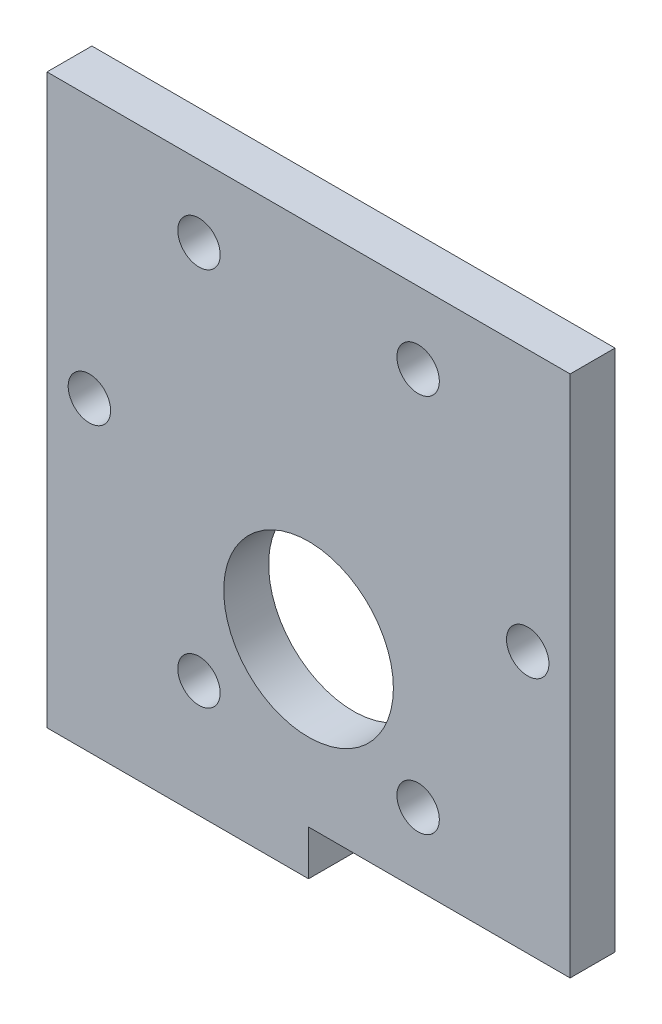
ISO-10303-21;
HEADER;
FILE_DESCRIPTION(('STEP AP214'),'2;1');
FILE_NAME('part.step','',(''),(''),'','','');
FILE_SCHEMA(('AUTOMOTIVE_DESIGN { 1 0 10303 214 1 1 1 1 }'));
ENDSEC;
DATA;
#1=APPLICATION_CONTEXT('core data for automotive mechanical design processes');
#2=APPLICATION_PROTOCOL_DEFINITION('international standard','automotive_design',2000,#1);
#3=PRODUCT_CONTEXT('',#1,'mechanical');
#4=PRODUCT('Part','Part','',(#3));
#5=PRODUCT_RELATED_PRODUCT_CATEGORY('part','',(#4));
#6=PRODUCT_DEFINITION_FORMATION('','',#4);
#7=PRODUCT_DEFINITION_CONTEXT('part definition',#1,'design');
#8=PRODUCT_DEFINITION('design','',#6,#7);
#9=PRODUCT_DEFINITION_SHAPE('','',#8);
#10=(LENGTH_UNIT() NAMED_UNIT(*) SI_UNIT(.MILLI.,.METRE.));
#11=(NAMED_UNIT(*) PLANE_ANGLE_UNIT() SI_UNIT($,.RADIAN.));
#12=(NAMED_UNIT(*) SI_UNIT($,.STERADIAN.) SOLID_ANGLE_UNIT());
#13=UNCERTAINTY_MEASURE_WITH_UNIT(LENGTH_MEASURE(1.E-05),#10,'distance_accuracy_value','');
#14=(GEOMETRIC_REPRESENTATION_CONTEXT(3) GLOBAL_UNCERTAINTY_ASSIGNED_CONTEXT((#13)) GLOBAL_UNIT_ASSIGNED_CONTEXT((#10,
#11,#12)) REPRESENTATION_CONTEXT('',''));
#15=CARTESIAN_POINT('',(0.,0.,0.));
#16=DIRECTION('',(0.,0.,1.));
#17=DIRECTION('',(1.,0.,0.));
#18=AXIS2_PLACEMENT_3D('',#15,#16,#17);
#19=CARTESIAN_POINT('',(0.,0.,3.175));
#20=DIRECTION('',(0.,0.,-1.));
#21=DIRECTION('',(-1.,0.,0.));
#22=AXIS2_PLACEMENT_3D('',#19,#20,#21);
#23=PLANE('',#22);
#24=DIRECTION('',(0.,-1.,0.));
#25=VECTOR('',#24,1.);
#26=CARTESIAN_POINT('',(0.,-3.175,3.175));
#27=LINE('',#26,#25);
#28=CARTESIAN_POINT('',(0.,37.,3.175));
#29=VERTEX_POINT('',#28);
#30=CARTESIAN_POINT('',(0.,-3.175,3.175));
#31=VERTEX_POINT('',#30);
#32=EDGE_CURVE('E50',#29,#31,#27,.T.);
#33=ORIENTED_EDGE('',*,*,#32,.T.);
#34=DIRECTION('',(1.,0.,0.));
#35=VECTOR('',#34,1.);
#36=CARTESIAN_POINT('',(18.5,-3.175,3.175));
#37=LINE('',#36,#35);
#38=CARTESIAN_POINT('',(18.5,-3.175,3.175));
#39=VERTEX_POINT('',#38);
#40=EDGE_CURVE('E88',#31,#39,#37,.T.);
#41=ORIENTED_EDGE('',*,*,#40,.T.);
#42=DIRECTION('',(0.,1.,0.));
#43=VECTOR('',#42,1.);
#44=CARTESIAN_POINT('',(18.5,0.,3.175));
#45=LINE('',#44,#43);
#46=CARTESIAN_POINT('',(18.5,0.,3.175));
#47=VERTEX_POINT('',#46);
#48=EDGE_CURVE('E102',#39,#47,#45,.T.);
#49=ORIENTED_EDGE('',*,*,#48,.T.);
#50=DIRECTION('',(1.,0.,0.));
#51=VECTOR('',#50,1.);
#52=CARTESIAN_POINT('',(18.5,0.,3.175));
#53=LINE('',#52,#51);
#54=CARTESIAN_POINT('',(37.,0.,3.175));
#55=VERTEX_POINT('',#54);
#56=EDGE_CURVE('E96',#47,#55,#53,.T.);
#57=ORIENTED_EDGE('',*,*,#56,.T.);
#58=DIRECTION('',(0.,1.,0.));
#59=VECTOR('',#58,1.);
#60=CARTESIAN_POINT('',(37.,0.,3.175));
#61=LINE('',#60,#59);
#62=CARTESIAN_POINT('',(37.,37.,3.175));
#63=VERTEX_POINT('',#62);
#64=EDGE_CURVE('E100',#55,#63,#61,.T.);
#65=ORIENTED_EDGE('',*,*,#64,.T.);
#66=DIRECTION('',(-1.,0.,0.));
#67=VECTOR('',#66,1.);
#68=CARTESIAN_POINT('',(0.,37.,3.175));
#69=LINE('',#68,#67);
#70=EDGE_CURVE('E116',#63,#29,#69,.T.);
#71=ORIENTED_EDGE('',*,*,#70,.T.);
#72=EDGE_LOOP('',(#33,#41,#49,#57,#65,#71));
#73=FACE_BOUND('',#72,.T.);
#74=CARTESIAN_POINT('',(18.4999999999999,11.5000000000001,3.175));
#75=DIRECTION('',(0.,0.,1.));
#76=DIRECTION('',(1.,0.,0.));
#77=AXIS2_PLACEMENT_3D('',#74,#75,#76);
#78=CIRCLE('',#77,6.);
#79=CARTESIAN_POINT('',(24.4999999999999,11.5000000000001,3.175));
#80=VERTEX_POINT('',#79);
#81=EDGE_CURVE('E125',#80,#80,#78,.T.);
#82=ORIENTED_EDGE('',*,*,#81,.F.);
#83=EDGE_LOOP('',(#82));
#84=FACE_BOUND('',#83,.T.);
#85=CARTESIAN_POINT('',(33.9999999999999,18.5000000000001,3.175));
#86=DIRECTION('',(0.,0.,1.));
#87=DIRECTION('',(1.,0.,0.));
#88=AXIS2_PLACEMENT_3D('',#85,#86,#87);
#89=CIRCLE('',#88,1.5);
#90=CARTESIAN_POINT('',(35.4999999999999,18.5000000000001,3.175));
#91=VERTEX_POINT('',#90);
#92=EDGE_CURVE('E151',#91,#91,#89,.T.);
#93=ORIENTED_EDGE('',*,*,#92,.F.);
#94=EDGE_LOOP('',(#93));
#95=FACE_BOUND('',#94,.T.);
#96=CARTESIAN_POINT('',(26.2499999999999,5.07660624134134,3.175));
#97=DIRECTION('',(0.,0.,1.));
#98=DIRECTION('',(1.,0.,0.));
#99=AXIS2_PLACEMENT_3D('',#96,#97,#98);
#100=CIRCLE('',#99,1.5);
#101=CARTESIAN_POINT('',(27.7499999999999,5.07660624134134,3.175));
#102=VERTEX_POINT('',#101);
#103=EDGE_CURVE('E157',#102,#102,#100,.T.);
#104=ORIENTED_EDGE('',*,*,#103,.F.);
#105=EDGE_LOOP('',(#104));
#106=FACE_BOUND('',#105,.T.);
#107=CARTESIAN_POINT('',(10.7499999999999,5.07660624134134,3.175));
#108=DIRECTION('',(0.,0.,1.));
#109=DIRECTION('',(1.,0.,0.));
#110=AXIS2_PLACEMENT_3D('',#107,#108,#109);
#111=CIRCLE('',#110,1.5);
#112=CARTESIAN_POINT('',(12.2499999999999,5.07660624134134,3.175));
#113=VERTEX_POINT('',#112);
#114=EDGE_CURVE('E163',#113,#113,#111,.T.);
#115=ORIENTED_EDGE('',*,*,#114,.F.);
#116=EDGE_LOOP('',(#115));
#117=FACE_BOUND('',#116,.T.);
#118=CARTESIAN_POINT('',(2.99999999999991,18.5000000000001,3.175));
#119=DIRECTION('',(0.,0.,1.));
#120=DIRECTION('',(1.,0.,0.));
#121=AXIS2_PLACEMENT_3D('',#118,#119,#120);
#122=CIRCLE('',#121,1.5);
#123=CARTESIAN_POINT('',(4.49999999999992,18.5000000000001,3.175));
#124=VERTEX_POINT('',#123);
#125=EDGE_CURVE('E169',#124,#124,#122,.T.);
#126=ORIENTED_EDGE('',*,*,#125,.F.);
#127=EDGE_LOOP('',(#126));
#128=FACE_BOUND('',#127,.T.);
#129=CARTESIAN_POINT('',(10.7499999999999,31.9233937586589,3.175));
#130=DIRECTION('',(0.,0.,1.));
#131=DIRECTION('',(1.,0.,0.));
#132=AXIS2_PLACEMENT_3D('',#129,#130,#131);
#133=CIRCLE('',#132,1.5);
#134=CARTESIAN_POINT('',(12.2499999999999,31.9233937586589,3.175));
#135=VERTEX_POINT('',#134);
#136=EDGE_CURVE('E175',#135,#135,#133,.T.);
#137=ORIENTED_EDGE('',*,*,#136,.F.);
#138=EDGE_LOOP('',(#137));
#139=FACE_BOUND('',#138,.T.);
#140=CARTESIAN_POINT('',(26.2499999999999,31.9233937586589,3.175));
#141=DIRECTION('',(0.,0.,1.));
#142=DIRECTION('',(1.,0.,0.));
#143=AXIS2_PLACEMENT_3D('',#140,#141,#142);
#144=CIRCLE('',#143,1.5);
#145=CARTESIAN_POINT('',(27.7499999999999,31.9233937586589,3.175));
#146=VERTEX_POINT('',#145);
#147=EDGE_CURVE('E181',#146,#146,#144,.T.);
#148=ORIENTED_EDGE('',*,*,#147,.F.);
#149=EDGE_LOOP('',(#148));
#150=FACE_BOUND('',#149,.T.);
#151=ADVANCED_FACE('F33',(#73,#84,#95,#106,#117,#128,#139,#150),#23,.F.);
#152=CARTESIAN_POINT('',(0.,0.,0.));
#153=DIRECTION('',(0.,0.,-1.));
#154=DIRECTION('',(-1.,0.,0.));
#155=AXIS2_PLACEMENT_3D('',#152,#153,#154);
#156=PLANE('',#155);
#157=CARTESIAN_POINT('',(10.7499999999999,31.9233937586589,0.));
#158=DIRECTION('',(0.,0.,1.));
#159=DIRECTION('',(1.,0.,0.));
#160=AXIS2_PLACEMENT_3D('',#157,#158,#159);
#161=CIRCLE('',#160,1.5);
#162=CARTESIAN_POINT('',(12.2499999999999,31.9233937586589,0.));
#163=VERTEX_POINT('',#162);
#164=EDGE_CURVE('E178',#163,#163,#161,.T.);
#165=ORIENTED_EDGE('',*,*,#164,.T.);
#166=EDGE_LOOP('',(#165));
#167=FACE_BOUND('',#166,.T.);
#168=CARTESIAN_POINT('',(10.7499999999999,5.07660624134134,0.));
#169=DIRECTION('',(0.,0.,1.));
#170=DIRECTION('',(1.,0.,0.));
#171=AXIS2_PLACEMENT_3D('',#168,#169,#170);
#172=CIRCLE('',#171,1.5);
#173=CARTESIAN_POINT('',(12.2499999999999,5.07660624134134,0.));
#174=VERTEX_POINT('',#173);
#175=EDGE_CURVE('E166',#174,#174,#172,.T.);
#176=ORIENTED_EDGE('',*,*,#175,.T.);
#177=EDGE_LOOP('',(#176));
#178=FACE_BOUND('',#177,.T.);
#179=CARTESIAN_POINT('',(33.9999999999999,18.5000000000001,0.));
#180=DIRECTION('',(0.,0.,1.));
#181=DIRECTION('',(1.,0.,0.));
#182=AXIS2_PLACEMENT_3D('',#179,#180,#181);
#183=CIRCLE('',#182,1.5);
#184=CARTESIAN_POINT('',(35.4999999999999,18.5000000000001,0.));
#185=VERTEX_POINT('',#184);
#186=EDGE_CURVE('E154',#185,#185,#183,.T.);
#187=ORIENTED_EDGE('',*,*,#186,.T.);
#188=EDGE_LOOP('',(#187));
#189=FACE_BOUND('',#188,.T.);
#190=DIRECTION('',(1.,0.,0.));
#191=VECTOR('',#190,1.);
#192=CARTESIAN_POINT('',(18.5,-3.175,0.));
#193=LINE('',#192,#191);
#194=CARTESIAN_POINT('',(0.,-3.175,0.));
#195=VERTEX_POINT('',#194);
#196=CARTESIAN_POINT('',(18.5,-3.175,0.));
#197=VERTEX_POINT('',#196);
#198=EDGE_CURVE('E122',#195,#197,#193,.T.);
#199=ORIENTED_EDGE('',*,*,#198,.F.);
#200=DIRECTION('',(0.,-1.,0.));
#201=VECTOR('',#200,1.);
#202=CARTESIAN_POINT('',(0.,0.,0.));
#203=LINE('',#202,#201);
#204=CARTESIAN_POINT('',(0.,37.,0.));
#205=VERTEX_POINT('',#204);
#206=EDGE_CURVE('E130',#205,#195,#203,.T.);
#207=ORIENTED_EDGE('',*,*,#206,.F.);
#208=DIRECTION('',(-1.,0.,0.));
#209=VECTOR('',#208,1.);
#210=CARTESIAN_POINT('',(0.,37.,0.));
#211=LINE('',#210,#209);
#212=CARTESIAN_POINT('',(37.,37.,0.));
#213=VERTEX_POINT('',#212);
#214=EDGE_CURVE('E81',#213,#205,#211,.T.);
#215=ORIENTED_EDGE('',*,*,#214,.F.);
#216=DIRECTION('',(0.,1.,0.));
#217=VECTOR('',#216,1.);
#218=CARTESIAN_POINT('',(37.,0.,0.));
#219=LINE('',#218,#217);
#220=CARTESIAN_POINT('',(37.,0.,0.));
#221=VERTEX_POINT('',#220);
#222=EDGE_CURVE('E74',#221,#213,#219,.T.);
#223=ORIENTED_EDGE('',*,*,#222,.F.);
#224=DIRECTION('',(1.,0.,0.));
#225=VECTOR('',#224,1.);
#226=CARTESIAN_POINT('',(18.5,0.,0.));
#227=LINE('',#226,#225);
#228=CARTESIAN_POINT('',(18.5,0.,0.));
#229=VERTEX_POINT('',#228);
#230=EDGE_CURVE('E110',#229,#221,#227,.T.);
#231=ORIENTED_EDGE('',*,*,#230,.F.);
#232=DIRECTION('',(0.,1.,0.));
#233=VECTOR('',#232,1.);
#234=CARTESIAN_POINT('',(18.5,0.,0.));
#235=LINE('',#234,#233);
#236=EDGE_CURVE('E124',#197,#229,#235,.T.);
#237=ORIENTED_EDGE('',*,*,#236,.F.);
#238=EDGE_LOOP('',(#199,#207,#215,#223,#231,#237));
#239=FACE_BOUND('',#238,.T.);
#240=CARTESIAN_POINT('',(18.4999999999999,11.5000000000001,0.));
#241=DIRECTION('',(0.,0.,1.));
#242=DIRECTION('',(1.,0.,0.));
#243=AXIS2_PLACEMENT_3D('',#240,#241,#242);
#244=CIRCLE('',#243,6.);
#245=CARTESIAN_POINT('',(24.4999999999999,11.5000000000001,0.));
#246=VERTEX_POINT('',#245);
#247=EDGE_CURVE('E148',#246,#246,#244,.T.);
#248=ORIENTED_EDGE('',*,*,#247,.T.);
#249=EDGE_LOOP('',(#248));
#250=FACE_BOUND('',#249,.T.);
#251=CARTESIAN_POINT('',(26.2499999999999,5.07660624134134,0.));
#252=DIRECTION('',(0.,0.,1.));
#253=DIRECTION('',(1.,0.,0.));
#254=AXIS2_PLACEMENT_3D('',#251,#252,#253);
#255=CIRCLE('',#254,1.5);
#256=CARTESIAN_POINT('',(27.7499999999999,5.07660624134134,0.));
#257=VERTEX_POINT('',#256);
#258=EDGE_CURVE('E160',#257,#257,#255,.T.);
#259=ORIENTED_EDGE('',*,*,#258,.T.);
#260=EDGE_LOOP('',(#259));
#261=FACE_BOUND('',#260,.T.);
#262=CARTESIAN_POINT('',(2.99999999999991,18.5000000000001,0.));
#263=DIRECTION('',(0.,0.,1.));
#264=DIRECTION('',(1.,0.,0.));
#265=AXIS2_PLACEMENT_3D('',#262,#263,#264);
#266=CIRCLE('',#265,1.5);
#267=CARTESIAN_POINT('',(4.49999999999992,18.5000000000001,0.));
#268=VERTEX_POINT('',#267);
#269=EDGE_CURVE('E172',#268,#268,#266,.T.);
#270=ORIENTED_EDGE('',*,*,#269,.T.);
#271=EDGE_LOOP('',(#270));
#272=FACE_BOUND('',#271,.T.);
#273=CARTESIAN_POINT('',(26.2499999999999,31.9233937586589,0.));
#274=DIRECTION('',(0.,0.,1.));
#275=DIRECTION('',(1.,0.,0.));
#276=AXIS2_PLACEMENT_3D('',#273,#274,#275);
#277=CIRCLE('',#276,1.5);
#278=CARTESIAN_POINT('',(27.7499999999999,31.9233937586589,0.));
#279=VERTEX_POINT('',#278);
#280=EDGE_CURVE('E184',#279,#279,#277,.T.);
#281=ORIENTED_EDGE('',*,*,#280,.T.);
#282=EDGE_LOOP('',(#281));
#283=FACE_BOUND('',#282,.T.);
#284=ADVANCED_FACE('F140',(#167,#178,#189,#239,#250,#261,#272,#283),#156,.T.);
#285=CARTESIAN_POINT('',(18.5,-3.175,3.175));
#286=DIRECTION('',(0.,1.,0.));
#287=DIRECTION('',(-1.,0.,0.));
#288=AXIS2_PLACEMENT_3D('',#285,#286,#287);
#289=PLANE('',#288);
#290=ORIENTED_EDGE('',*,*,#198,.T.);
#291=DIRECTION('',(0.,0.,-1.));
#292=VECTOR('',#291,1.);
#293=CARTESIAN_POINT('',(18.5,-3.175,3.175));
#294=LINE('',#293,#292);
#295=EDGE_CURVE('E42',#39,#197,#294,.T.);
#296=ORIENTED_EDGE('',*,*,#295,.F.);
#297=ORIENTED_EDGE('',*,*,#40,.F.);
#298=DIRECTION('',(0.,0.,-1.));
#299=VECTOR('',#298,1.);
#300=CARTESIAN_POINT('',(0.,-3.175,3.175));
#301=LINE('',#300,#299);
#302=EDGE_CURVE('E11',#31,#195,#301,.T.);
#303=ORIENTED_EDGE('',*,*,#302,.T.);
#304=EDGE_LOOP('',(#290,#296,#297,#303));
#305=FACE_BOUND('',#304,.T.);
#306=ADVANCED_FACE('F35',(#305),#289,.F.);
#307=CARTESIAN_POINT('',(18.5,0.,3.175));
#308=DIRECTION('',(-1.,0.,0.));
#309=DIRECTION('',(0.,0.,1.));
#310=AXIS2_PLACEMENT_3D('',#307,#308,#309);
#311=PLANE('',#310);
#312=ORIENTED_EDGE('',*,*,#236,.T.);
#313=DIRECTION('',(0.,0.,-1.));
#314=VECTOR('',#313,1.);
#315=CARTESIAN_POINT('',(18.5,0.,3.175));
#316=LINE('',#315,#314);
#317=EDGE_CURVE('E111',#47,#229,#316,.T.);
#318=ORIENTED_EDGE('',*,*,#317,.F.);
#319=ORIENTED_EDGE('',*,*,#48,.F.);
#320=ORIENTED_EDGE('',*,*,#295,.T.);
#321=EDGE_LOOP('',(#312,#318,#319,#320));
#322=FACE_BOUND('',#321,.T.);
#323=ADVANCED_FACE('F137',(#322),#311,.F.);
#324=CARTESIAN_POINT('',(18.5,0.,3.175));
#325=DIRECTION('',(0.,1.,0.));
#326=DIRECTION('',(-1.,0.,0.));
#327=AXIS2_PLACEMENT_3D('',#324,#325,#326);
#328=PLANE('',#327);
#329=ORIENTED_EDGE('',*,*,#230,.T.);
#330=DIRECTION('',(0.,0.,-1.));
#331=VECTOR('',#330,1.);
#332=CARTESIAN_POINT('',(37.,0.,3.175));
#333=LINE('',#332,#331);
#334=EDGE_CURVE('E107',#55,#221,#333,.T.);
#335=ORIENTED_EDGE('',*,*,#334,.F.);
#336=ORIENTED_EDGE('',*,*,#56,.F.);
#337=ORIENTED_EDGE('',*,*,#317,.T.);
#338=EDGE_LOOP('',(#329,#335,#336,#337));
#339=FACE_BOUND('',#338,.T.);
#340=ADVANCED_FACE('F108',(#339),#328,.F.);
#341=CARTESIAN_POINT('',(37.,0.,3.175));
#342=DIRECTION('',(-1.,0.,0.));
#343=DIRECTION('',(0.,0.,1.));
#344=AXIS2_PLACEMENT_3D('',#341,#342,#343);
#345=PLANE('',#344);
#346=ORIENTED_EDGE('',*,*,#222,.T.);
#347=DIRECTION('',(0.,0.,-1.));
#348=VECTOR('',#347,1.);
#349=CARTESIAN_POINT('',(37.,37.,3.175));
#350=LINE('',#349,#348);
#351=EDGE_CURVE('E112',#63,#213,#350,.T.);
#352=ORIENTED_EDGE('',*,*,#351,.F.);
#353=ORIENTED_EDGE('',*,*,#64,.F.);
#354=ORIENTED_EDGE('',*,*,#334,.T.);
#355=EDGE_LOOP('',(#346,#352,#353,#354));
#356=FACE_BOUND('',#355,.T.);
#357=ADVANCED_FACE('F114',(#356),#345,.F.);
#358=CARTESIAN_POINT('',(0.,37.,3.175));
#359=DIRECTION('',(0.,-1.,0.));
#360=DIRECTION('',(0.,0.,-1.));
#361=AXIS2_PLACEMENT_3D('',#358,#359,#360);
#362=PLANE('',#361);
#363=ORIENTED_EDGE('',*,*,#214,.T.);
#364=DIRECTION('',(0.,0.,-1.));
#365=VECTOR('',#364,1.);
#366=CARTESIAN_POINT('',(0.,37.,3.175));
#367=LINE('',#366,#365);
#368=EDGE_CURVE('E118',#29,#205,#367,.T.);
#369=ORIENTED_EDGE('',*,*,#368,.F.);
#370=ORIENTED_EDGE('',*,*,#70,.F.);
#371=ORIENTED_EDGE('',*,*,#351,.T.);
#372=EDGE_LOOP('',(#363,#369,#370,#371));
#373=FACE_BOUND('',#372,.T.);
#374=ADVANCED_FACE('F144',(#373),#362,.F.);
#375=CARTESIAN_POINT('',(0.,0.,3.175));
#376=DIRECTION('',(1.,0.,0.));
#377=DIRECTION('',(0.,0.,-1.));
#378=AXIS2_PLACEMENT_3D('',#375,#376,#377);
#379=PLANE('',#378);
#380=ORIENTED_EDGE('',*,*,#206,.T.);
#381=ORIENTED_EDGE('',*,*,#302,.F.);
#382=ORIENTED_EDGE('',*,*,#32,.F.);
#383=ORIENTED_EDGE('',*,*,#368,.T.);
#384=EDGE_LOOP('',(#380,#381,#382,#383));
#385=FACE_BOUND('',#384,.T.);
#386=ADVANCED_FACE('F143',(#385),#379,.F.);
#387=CARTESIAN_POINT('',(18.4999999999999,11.5000000000001,3.175));
#388=DIRECTION('',(0.,0.,-1.));
#389=DIRECTION('',(-1.,0.,0.));
#390=AXIS2_PLACEMENT_3D('',#387,#388,#389);
#391=CYLINDRICAL_SURFACE('',#390,6.);
#392=ORIENTED_EDGE('',*,*,#81,.T.);
#393=EDGE_LOOP('',(#392));
#394=FACE_BOUND('',#393,.T.);
#395=ORIENTED_EDGE('',*,*,#247,.F.);
#396=EDGE_LOOP('',(#395));
#397=FACE_BOUND('',#396,.T.);
#398=ADVANCED_FACE('F201',(#394,#397),#391,.F.);
#399=CARTESIAN_POINT('',(33.9999999999999,18.5000000000001,3.175));
#400=DIRECTION('',(0.,0.,-1.));
#401=DIRECTION('',(-1.,0.,0.));
#402=AXIS2_PLACEMENT_3D('',#399,#400,#401);
#403=CYLINDRICAL_SURFACE('',#402,1.5);
#404=ORIENTED_EDGE('',*,*,#92,.T.);
#405=EDGE_LOOP('',(#404));
#406=FACE_BOUND('',#405,.T.);
#407=ORIENTED_EDGE('',*,*,#186,.F.);
#408=EDGE_LOOP('',(#407));
#409=FACE_BOUND('',#408,.T.);
#410=ADVANCED_FACE('F264',(#406,#409),#403,.F.);
#411=CARTESIAN_POINT('',(26.2499999999999,5.07660624134134,3.175));
#412=DIRECTION('',(0.,0.,-1.));
#413=DIRECTION('',(-1.,0.,0.));
#414=AXIS2_PLACEMENT_3D('',#411,#412,#413);
#415=CYLINDRICAL_SURFACE('',#414,1.5);
#416=ORIENTED_EDGE('',*,*,#103,.T.);
#417=EDGE_LOOP('',(#416));
#418=FACE_BOUND('',#417,.T.);
#419=ORIENTED_EDGE('',*,*,#258,.F.);
#420=EDGE_LOOP('',(#419));
#421=FACE_BOUND('',#420,.T.);
#422=ADVANCED_FACE('F272',(#418,#421),#415,.F.);
#423=CARTESIAN_POINT('',(10.7499999999999,5.07660624134134,3.175));
#424=DIRECTION('',(0.,0.,-1.));
#425=DIRECTION('',(-1.,0.,0.));
#426=AXIS2_PLACEMENT_3D('',#423,#424,#425);
#427=CYLINDRICAL_SURFACE('',#426,1.5);
#428=ORIENTED_EDGE('',*,*,#114,.T.);
#429=EDGE_LOOP('',(#428));
#430=FACE_BOUND('',#429,.T.);
#431=ORIENTED_EDGE('',*,*,#175,.F.);
#432=EDGE_LOOP('',(#431));
#433=FACE_BOUND('',#432,.T.);
#434=ADVANCED_FACE('F280',(#430,#433),#427,.F.);
#435=CARTESIAN_POINT('',(2.99999999999991,18.5000000000001,3.175));
#436=DIRECTION('',(0.,0.,-1.));
#437=DIRECTION('',(-1.,0.,0.));
#438=AXIS2_PLACEMENT_3D('',#435,#436,#437);
#439=CYLINDRICAL_SURFACE('',#438,1.5);
#440=ORIENTED_EDGE('',*,*,#125,.T.);
#441=EDGE_LOOP('',(#440));
#442=FACE_BOUND('',#441,.T.);
#443=ORIENTED_EDGE('',*,*,#269,.F.);
#444=EDGE_LOOP('',(#443));
#445=FACE_BOUND('',#444,.T.);
#446=ADVANCED_FACE('F289',(#442,#445),#439,.F.);
#447=CARTESIAN_POINT('',(10.7499999999999,31.9233937586589,3.175));
#448=DIRECTION('',(0.,0.,-1.));
#449=DIRECTION('',(-1.,0.,0.));
#450=AXIS2_PLACEMENT_3D('',#447,#448,#449);
#451=CYLINDRICAL_SURFACE('',#450,1.5);
#452=ORIENTED_EDGE('',*,*,#136,.T.);
#453=EDGE_LOOP('',(#452));
#454=FACE_BOUND('',#453,.T.);
#455=ORIENTED_EDGE('',*,*,#164,.F.);
#456=EDGE_LOOP('',(#455));
#457=FACE_BOUND('',#456,.T.);
#458=ADVANCED_FACE('F298',(#454,#457),#451,.F.);
#459=CARTESIAN_POINT('',(26.2499999999999,31.9233937586589,3.175));
#460=DIRECTION('',(0.,0.,-1.));
#461=DIRECTION('',(-1.,0.,0.));
#462=AXIS2_PLACEMENT_3D('',#459,#460,#461);
#463=CYLINDRICAL_SURFACE('',#462,1.5);
#464=ORIENTED_EDGE('',*,*,#147,.T.);
#465=EDGE_LOOP('',(#464));
#466=FACE_BOUND('',#465,.T.);
#467=ORIENTED_EDGE('',*,*,#280,.F.);
#468=EDGE_LOOP('',(#467));
#469=FACE_BOUND('',#468,.T.);
#470=ADVANCED_FACE('F190',(#466,#469),#463,.F.);
#471=CLOSED_SHELL('',(#151,#284,#306,#323,#340,#357,#374,#386,#398,#410,#422,#434,#446,#458,#470));
#472=MANIFOLD_SOLID_BREP('B2',#471);
#473=ADVANCED_BREP_SHAPE_REPRESENTATION('',(#18,#472),#14);
#474=SHAPE_DEFINITION_REPRESENTATION(#9,#473);
ENDSEC;
END-ISO-10303-21;
